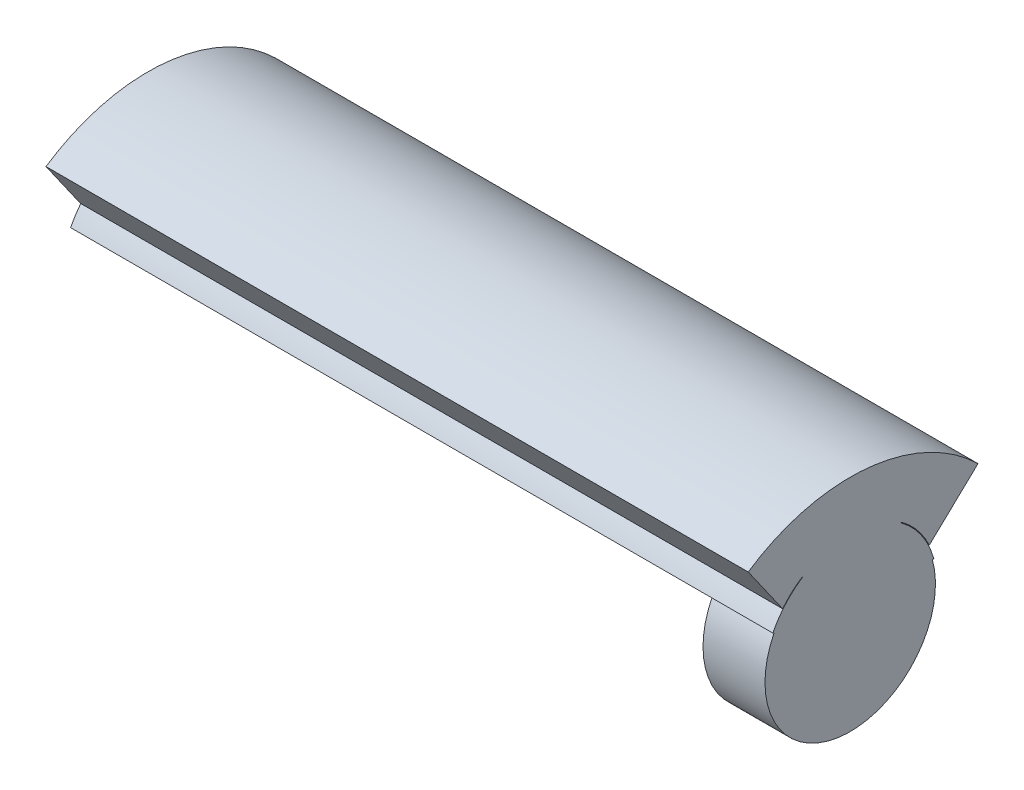
ISO-10303-21;
HEADER;
FILE_DESCRIPTION(('STEP AP214'),'2;1');
FILE_NAME('part.step','',(''),(''),'','','');
FILE_SCHEMA(('AUTOMOTIVE_DESIGN { 1 0 10303 214 1 1 1 1 }'));
ENDSEC;
DATA;
#1=APPLICATION_CONTEXT('core data for automotive mechanical design processes');
#2=APPLICATION_PROTOCOL_DEFINITION('international standard','automotive_design',2000,#1);
#3=PRODUCT_CONTEXT('',#1,'mechanical');
#4=PRODUCT('Part','Part','',(#3));
#5=PRODUCT_RELATED_PRODUCT_CATEGORY('part','',(#4));
#6=PRODUCT_DEFINITION_FORMATION('','',#4);
#7=PRODUCT_DEFINITION_CONTEXT('part definition',#1,'design');
#8=PRODUCT_DEFINITION('design','',#6,#7);
#9=PRODUCT_DEFINITION_SHAPE('','',#8);
#10=(LENGTH_UNIT() NAMED_UNIT(*) SI_UNIT(.MILLI.,.METRE.));
#11=(NAMED_UNIT(*) PLANE_ANGLE_UNIT() SI_UNIT($,.RADIAN.));
#12=(NAMED_UNIT(*) SI_UNIT($,.STERADIAN.) SOLID_ANGLE_UNIT());
#13=UNCERTAINTY_MEASURE_WITH_UNIT(LENGTH_MEASURE(1.E-05),#10,'distance_accuracy_value','');
#14=(GEOMETRIC_REPRESENTATION_CONTEXT(3) GLOBAL_UNCERTAINTY_ASSIGNED_CONTEXT((#13)) GLOBAL_UNIT_ASSIGNED_CONTEXT((#10,
#11,#12)) REPRESENTATION_CONTEXT('',''));
#15=CARTESIAN_POINT('',(0.,0.,0.));
#16=DIRECTION('',(0.,0.,1.));
#17=DIRECTION('',(1.,0.,0.));
#18=AXIS2_PLACEMENT_3D('',#15,#16,#17);
#19=CARTESIAN_POINT('',(355.,63.9564545478347,86.5130861916393));
#20=DIRECTION('',(1.,0.,0.));
#21=DIRECTION('',(0.,0.,-1.));
#22=AXIS2_PLACEMENT_3D('',#19,#20,#21);
#23=CYLINDRICAL_SURFACE('',#22,20.6352320189798);
#24=DIRECTION('',(1.,0.,0.));
#25=VECTOR('',#24,1.);
#26=CARTESIAN_POINT('',(355.,73.2097109224673,104.957327757571));
#27=LINE('',#26,#25);
#28=CARTESIAN_POINT('',(355.,73.2097109224673,104.957327757571));
#29=VERTEX_POINT('',#28);
#30=CARTESIAN_POINT('',(370.,73.2097109224673,104.957327757571));
#31=VERTEX_POINT('',#30);
#32=EDGE_CURVE('E289',#29,#31,#27,.T.);
#33=ORIENTED_EDGE('',*,*,#32,.F.);
#34=CARTESIAN_POINT('',(355.,63.9564545478347,86.5130861916393));
#35=DIRECTION('',(1.,0.,0.));
#36=DIRECTION('',(0.,0.,-1.));
#37=AXIS2_PLACEMENT_3D('',#34,#35,#36);
#38=CIRCLE('',#37,20.6352320189798);
#39=CARTESIAN_POINT('',(355.,69.3718571058935,66.6011245702596));
#40=VERTEX_POINT('',#39);
#41=EDGE_CURVE('E11',#29,#40,#38,.T.);
#42=ORIENTED_EDGE('',*,*,#41,.T.);
#43=DIRECTION('',(1.,0.,0.));
#44=VECTOR('',#43,1.);
#45=CARTESIAN_POINT('',(355.,69.3718571058935,66.6011245702596));
#46=LINE('',#45,#44);
#47=CARTESIAN_POINT('',(370.,69.3718571058935,66.6011245702596));
#48=VERTEX_POINT('',#47);
#49=EDGE_CURVE('E57',#48,#40,#46,.F.);
#50=ORIENTED_EDGE('',*,*,#49,.F.);
#51=CARTESIAN_POINT('',(370.,63.9564545478347,86.5130861916393));
#52=DIRECTION('',(1.,0.,0.));
#53=DIRECTION('',(0.,0.,-1.));
#54=AXIS2_PLACEMENT_3D('',#51,#52,#53);
#55=CIRCLE('',#54,20.6352320189798);
#56=EDGE_CURVE('E46',#31,#48,#55,.T.);
#57=ORIENTED_EDGE('',*,*,#56,.F.);
#58=EDGE_LOOP('',(#33,#42,#50,#57));
#59=FACE_BOUND('',#58,.T.);
#60=ADVANCED_FACE('F43',(#59),#23,.T.);
#61=CARTESIAN_POINT('',(355.,63.9564545478347,86.5130861916393));
#62=DIRECTION('',(1.,0.,0.));
#63=DIRECTION('',(0.,0.,-1.));
#64=AXIS2_PLACEMENT_3D('',#61,#62,#63);
#65=PLANE('',#64);
#66=ORIENTED_EDGE('',*,*,#41,.F.);
#67=DIRECTION('',(0.,-0.448420272964308,-0.893822834120172));
#68=VECTOR('',#67,1.);
#69=CARTESIAN_POINT('',(355.,63.9564545478346,86.5130861916393));
#70=LINE('',#69,#68);
#71=CARTESIAN_POINT('',(355.,72.692351211514,103.926089985811));
#72=VERTEX_POINT('',#71);
#73=EDGE_CURVE('E65',#29,#72,#70,.T.);
#74=ORIENTED_EDGE('',*,*,#73,.T.);
#75=CARTESIAN_POINT('',(355.,63.9564545478347,86.5130861916393));
#76=DIRECTION('',(1.,0.,0.));
#77=DIRECTION('',(0.,0.,-1.));
#78=AXIS2_PLACEMENT_3D('',#75,#76,#77);
#79=CIRCLE('',#78,19.4814935683668);
#80=CARTESIAN_POINT('',(355.,81.4344426394317,95.1182313922916));
#81=VERTEX_POINT('',#80);
#82=EDGE_CURVE('E285',#72,#81,#79,.F.);
#83=ORIENTED_EDGE('',*,*,#82,.T.);
#84=DIRECTION('',(0.,-0.0222625521516225,-0.999752158673187));
#85=VECTOR('',#84,1.);
#86=CARTESIAN_POINT('',(355.,81.2342551632847,86.1283428990844));
#87=LINE('',#86,#85);
#88=CARTESIAN_POINT('',(355.,81.0340676871377,77.1384544058772));
#89=VERTEX_POINT('',#88);
#90=EDGE_CURVE('E291',#81,#89,#87,.T.);
#91=ORIENTED_EDGE('',*,*,#90,.T.);
#92=CARTESIAN_POINT('',(355.,63.9564545478347,86.5130861916393));
#93=DIRECTION('',(1.,0.,0.));
#94=DIRECTION('',(0.,0.,-1.));
#95=AXIS2_PLACEMENT_3D('',#92,#93,#94);
#96=CIRCLE('',#95,19.4814935683668);
#97=CARTESIAN_POINT('',(355.,69.0690760103849,67.7144241798102));
#98=VERTEX_POINT('',#97);
#99=EDGE_CURVE('E282',#89,#98,#96,.F.);
#100=ORIENTED_EDGE('',*,*,#99,.T.);
#101=DIRECTION('',(0.,0.262434779171761,-0.964949732722419));
#102=VECTOR('',#101,1.);
#103=CARTESIAN_POINT('',(355.,63.9564545478345,86.5130861916392));
#104=LINE('',#103,#102);
#105=EDGE_CURVE('E267',#98,#40,#104,.T.);
#106=ORIENTED_EDGE('',*,*,#105,.T.);
#107=EDGE_LOOP('',(#66,#74,#83,#91,#100,#106));
#108=FACE_BOUND('',#107,.T.);
#109=ADVANCED_FACE('F300',(#108),#65,.F.);
#110=CARTESIAN_POINT('',(370.,63.9564545478347,86.5130861916393));
#111=DIRECTION('',(1.,0.,0.));
#112=DIRECTION('',(0.,0.,-1.));
#113=AXIS2_PLACEMENT_3D('',#110,#111,#112);
#114=PLANE('',#113);
#115=ORIENTED_EDGE('',*,*,#56,.T.);
#116=DIRECTION('',(0.,0.262434779171761,-0.964949732722419));
#117=VECTOR('',#116,1.);
#118=CARTESIAN_POINT('',(370.,69.0690760103849,67.7144241798102));
#119=LINE('',#118,#117);
#120=CARTESIAN_POINT('',(370.,69.4593670539627,66.2793581440778));
#121=VERTEX_POINT('',#120);
#122=EDGE_CURVE('E200',#48,#121,#119,.T.);
#123=ORIENTED_EDGE('',*,*,#122,.T.);
#124=CARTESIAN_POINT('',(370.,63.9564545478347,86.5130861916393));
#125=DIRECTION('',(1.,0.,0.));
#126=DIRECTION('',(0.,0.,-1.));
#127=AXIS2_PLACEMENT_3D('',#124,#125,#126);
#128=CIRCLE('',#127,20.9686860998198);
#129=CARTESIAN_POINT('',(370.,80.9698875905979,74.2562965282654));
#130=VERTEX_POINT('',#129);
#131=EDGE_CURVE('E174',#121,#130,#128,.T.);
#132=ORIENTED_EDGE('',*,*,#131,.T.);
#133=DIRECTION('',(0.,-0.0222625521516225,-0.999752158673186));
#134=VECTOR('',#133,1.);
#135=CARTESIAN_POINT('',(370.,81.5038252394239,98.2340198986652));
#136=LINE('',#135,#134);
#137=CARTESIAN_POINT('',(370.,80.9646850871455,74.0226658995036));
#138=VERTEX_POINT('',#137);
#139=EDGE_CURVE('E256',#130,#138,#136,.T.);
#140=ORIENTED_EDGE('',*,*,#139,.T.);
#141=CARTESIAN_POINT('',(370.,63.9564545478347,86.5130861916393));
#142=DIRECTION('',(-1.,0.,0.));
#143=DIRECTION('',(0.,0.,-1.));
#144=AXIS2_PLACEMENT_3D('',#141,#142,#143);
#145=CIRCLE('',#144,21.101907618804);
#146=CARTESIAN_POINT('',(370.,72.8377741351527,67.3711775213823));
#147=VERTEX_POINT('',#146);
#148=EDGE_CURVE('E260',#138,#147,#145,.T.);
#149=ORIENTED_EDGE('',*,*,#148,.T.);
#150=DIRECTION('',(0.,0.688782001001725,-0.724968520072465));
#151=VECTOR('',#150,1.);
#152=CARTESIAN_POINT('',(370.,84.0422777194896,55.5780232724764));
#153=LINE('',#152,#151);
#154=CARTESIAN_POINT('',(370.,84.0422777194896,55.5780232724764));
#155=VERTEX_POINT('',#154);
#156=EDGE_CURVE('E225',#147,#155,#153,.T.);
#157=ORIENTED_EDGE('',*,*,#156,.T.);
#158=CARTESIAN_POINT('',(370.,52.4819849623086,86.5215495386486));
#159=DIRECTION('',(1.,0.,0.));
#160=DIRECTION('',(0.,0.,-1.));
#161=AXIS2_PLACEMENT_3D('',#158,#159,#160);
#162=CIRCLE('',#161,44.1990259700852);
#163=CARTESIAN_POINT('',(370.,89.1441466159733,111.208384078233));
#164=VERTEX_POINT('',#163);
#165=EDGE_CURVE('E220',#155,#164,#162,.T.);
#166=ORIENTED_EDGE('',*,*,#165,.T.);
#167=DIRECTION('',(0.,-0.818745483426985,-0.574156627905585));
#168=VECTOR('',#167,1.);
#169=CARTESIAN_POINT('',(370.,89.1441466159733,111.208384078233));
#170=LINE('',#169,#168);
#171=CARTESIAN_POINT('',(370.,77.2723371062821,102.883112973602));
#172=VERTEX_POINT('',#171);
#173=EDGE_CURVE('E247',#164,#172,#170,.T.);
#174=ORIENTED_EDGE('',*,*,#173,.T.);
#175=DIRECTION('',(0.,0.740927549635329,-0.671584965727634));
#176=VECTOR('',#175,1.);
#177=CARTESIAN_POINT('',(370.,78.9435134796605,101.368340135161));
#178=LINE('',#177,#176);
#179=CARTESIAN_POINT('',(370.,78.9435134796605,101.368340135161));
#180=VERTEX_POINT('',#179);
#181=EDGE_CURVE('E250',#172,#180,#178,.T.);
#182=ORIENTED_EDGE('',*,*,#181,.T.);
#183=CARTESIAN_POINT('',(370.,63.9564545478346,86.5130861916393));
#184=DIRECTION('',(-1.,0.,0.));
#185=DIRECTION('',(0.,0.,-1.));
#186=AXIS2_PLACEMENT_3D('',#183,#184,#185);
#187=CIRCLE('',#186,21.1019076188041);
#188=CARTESIAN_POINT('',(370.,81.5038252394239,98.2340198986652));
#189=VERTEX_POINT('',#188);
#190=EDGE_CURVE('E253',#180,#189,#187,.T.);
#191=ORIENTED_EDGE('',*,*,#190,.T.);
#192=CARTESIAN_POINT('',(370.,81.4986227359715,98.0003892699034));
#193=VERTEX_POINT('',#192);
#194=EDGE_CURVE('E257',#189,#193,#136,.T.);
#195=ORIENTED_EDGE('',*,*,#194,.T.);
#196=CARTESIAN_POINT('',(370.,63.9564545478347,86.5130861916393));
#197=DIRECTION('',(1.,0.,0.));
#198=DIRECTION('',(0.,0.,-1.));
#199=AXIS2_PLACEMENT_3D('',#196,#197,#198);
#200=CIRCLE('',#199,20.9686860998198);
#201=CARTESIAN_POINT('',(370.,73.3592384924187,105.255376629157));
#202=VERTEX_POINT('',#201);
#203=EDGE_CURVE('E197',#193,#202,#200,.T.);
#204=ORIENTED_EDGE('',*,*,#203,.T.);
#205=DIRECTION('',(0.,-0.448420272964307,-0.893822834120172));
#206=VECTOR('',#205,1.);
#207=CARTESIAN_POINT('',(370.,73.3592384924187,105.255376629157));
#208=LINE('',#207,#206);
#209=EDGE_CURVE('E179',#202,#31,#208,.T.);
#210=ORIENTED_EDGE('',*,*,#209,.T.);
#211=EDGE_LOOP('',(#115,#123,#132,#140,#149,#157,#166,#174,#182,#191,#195,#204,#210));
#212=FACE_BOUND('',#211,.T.);
#213=ADVANCED_FACE('F297',(#212),#114,.T.);
#214=CARTESIAN_POINT('',(200.,81.5038252394239,98.2340198986652));
#215=DIRECTION('',(0.,-0.999752158673186,0.0222625521516225));
#216=DIRECTION('',(0.,-0.0222625521516225,-0.999752158673187));
#217=AXIS2_PLACEMENT_3D('',#214,#215,#216);
#218=PLANE('',#217);
#219=ORIENTED_EDGE('',*,*,#90,.F.);
#220=DIRECTION('',(1.,0.,0.));
#221=VECTOR('',#220,1.);
#222=CARTESIAN_POINT('',(200.,81.4344426394317,95.1182313922916));
#223=LINE('',#222,#221);
#224=CARTESIAN_POINT('',(200.,81.4344426394317,95.1182313922916));
#225=VERTEX_POINT('',#224);
#226=EDGE_CURVE('E212',#225,#81,#223,.T.);
#227=ORIENTED_EDGE('',*,*,#226,.F.);
#228=DIRECTION('',(0.,-0.0222625521516225,-0.999752158673186));
#229=VECTOR('',#228,1.);
#230=CARTESIAN_POINT('',(200.,81.5038252394239,98.2340198986652));
#231=LINE('',#230,#229);
#232=CARTESIAN_POINT('',(200.,81.0340676871377,77.1384544058772));
#233=VERTEX_POINT('',#232);
#234=EDGE_CURVE('E238',#225,#233,#231,.T.);
#235=ORIENTED_EDGE('',*,*,#234,.T.);
#236=DIRECTION('',(1.,0.,0.));
#237=VECTOR('',#236,1.);
#238=CARTESIAN_POINT('',(200.,81.0340676871377,77.1384544058772));
#239=LINE('',#238,#237);
#240=EDGE_CURVE('E215',#89,#233,#239,.F.);
#241=ORIENTED_EDGE('',*,*,#240,.F.);
#242=EDGE_LOOP('',(#219,#227,#235,#241));
#243=FACE_BOUND('',#242,.T.);
#244=ADVANCED_FACE('F345',(#243),#218,.T.);
#245=CARTESIAN_POINT('',(200.,63.9564545478347,86.5130861916393));
#246=DIRECTION('',(1.,0.,0.));
#247=DIRECTION('',(0.,0.,-1.));
#248=AXIS2_PLACEMENT_3D('',#245,#246,#247);
#249=CYLINDRICAL_SURFACE('',#248,19.4814935683668);
#250=ORIENTED_EDGE('',*,*,#82,.F.);
#251=DIRECTION('',(1.,0.,0.));
#252=VECTOR('',#251,1.);
#253=CARTESIAN_POINT('',(200.,72.692351211514,103.926089985811));
#254=LINE('',#253,#252);
#255=CARTESIAN_POINT('',(200.,72.692351211514,103.926089985811));
#256=VERTEX_POINT('',#255);
#257=EDGE_CURVE('E180',#256,#72,#254,.T.);
#258=ORIENTED_EDGE('',*,*,#257,.F.);
#259=CARTESIAN_POINT('',(200.,63.9564545478347,86.5130861916393));
#260=DIRECTION('',(-1.,0.,0.));
#261=DIRECTION('',(0.,0.,-1.));
#262=AXIS2_PLACEMENT_3D('',#259,#260,#261);
#263=CIRCLE('',#262,19.4814935683668);
#264=EDGE_CURVE('E187',#256,#225,#263,.T.);
#265=ORIENTED_EDGE('',*,*,#264,.T.);
#266=ORIENTED_EDGE('',*,*,#226,.T.);
#267=EDGE_LOOP('',(#250,#258,#265,#266));
#268=FACE_BOUND('',#267,.T.);
#269=ADVANCED_FACE('F347',(#268),#249,.F.);
#270=ORIENTED_EDGE('',*,*,#99,.F.);
#271=ORIENTED_EDGE('',*,*,#240,.T.);
#272=CARTESIAN_POINT('',(200.,69.0690760103849,67.7144241798102));
#273=VERTEX_POINT('',#272);
#274=EDGE_CURVE('E188',#233,#273,#263,.T.);
#275=ORIENTED_EDGE('',*,*,#274,.T.);
#276=DIRECTION('',(1.,0.,0.));
#277=VECTOR('',#276,1.);
#278=CARTESIAN_POINT('',(200.,69.0690760103849,67.7144241798102));
#279=LINE('',#278,#277);
#280=EDGE_CURVE('E207',#273,#98,#279,.T.);
#281=ORIENTED_EDGE('',*,*,#280,.T.);
#282=EDGE_LOOP('',(#270,#271,#275,#281));
#283=FACE_BOUND('',#282,.T.);
#284=ADVANCED_FACE('F305',(#283),#249,.F.);
#285=DIRECTION('',(1.,0.,0.));
#286=VECTOR('',#285,1.);
#287=CARTESIAN_POINT('',(200.,80.9698875905979,74.2562965282654));
#288=LINE('',#287,#286);
#289=CARTESIAN_POINT('',(200.,80.9698875905979,74.2562965282654));
#290=VERTEX_POINT('',#289);
#291=EDGE_CURVE('E217',#290,#130,#288,.T.);
#292=ORIENTED_EDGE('',*,*,#291,.F.);
#293=CARTESIAN_POINT('',(200.,80.9646850871455,74.0226658995036));
#294=VERTEX_POINT('',#293);
#295=EDGE_CURVE('E234',#290,#294,#231,.T.);
#296=ORIENTED_EDGE('',*,*,#295,.T.);
#297=DIRECTION('',(1.,0.,0.));
#298=VECTOR('',#297,1.);
#299=CARTESIAN_POINT('',(200.,80.9646850871455,74.0226658995036));
#300=LINE('',#299,#298);
#301=EDGE_CURVE('E270',#294,#138,#300,.T.);
#302=ORIENTED_EDGE('',*,*,#301,.T.);
#303=ORIENTED_EDGE('',*,*,#139,.F.);
#304=EDGE_LOOP('',(#292,#296,#302,#303));
#305=FACE_BOUND('',#304,.T.);
#306=ADVANCED_FACE('F318',(#305),#218,.T.);
#307=CARTESIAN_POINT('',(200.,52.4819849623086,86.5215495386486));
#308=DIRECTION('',(1.,0.,0.));
#309=DIRECTION('',(0.,0.,-1.));
#310=AXIS2_PLACEMENT_3D('',#307,#308,#309);
#311=CYLINDRICAL_SURFACE('',#310,44.1990259700852);
#312=ORIENTED_EDGE('',*,*,#165,.F.);
#313=DIRECTION('',(1.,0.,0.));
#314=VECTOR('',#313,1.);
#315=CARTESIAN_POINT('',(200.,84.0422777194896,55.5780232724764));
#316=LINE('',#315,#314);
#317=CARTESIAN_POINT('',(200.,84.0422777194896,55.5780232724764));
#318=VERTEX_POINT('',#317);
#319=EDGE_CURVE('E265',#318,#155,#316,.T.);
#320=ORIENTED_EDGE('',*,*,#319,.F.);
#321=CARTESIAN_POINT('',(200.,52.4819849623086,86.5215495386486));
#322=DIRECTION('',(1.,0.,0.));
#323=DIRECTION('',(0.,0.,-1.));
#324=AXIS2_PLACEMENT_3D('',#321,#322,#323);
#325=CIRCLE('',#324,44.1990259700852);
#326=CARTESIAN_POINT('',(200.,89.1441466159733,111.208384078233));
#327=VERTEX_POINT('',#326);
#328=EDGE_CURVE('E221',#318,#327,#325,.T.);
#329=ORIENTED_EDGE('',*,*,#328,.T.);
#330=DIRECTION('',(1.,0.,0.));
#331=VECTOR('',#330,1.);
#332=CARTESIAN_POINT('',(200.,89.1441466159733,111.208384078233));
#333=LINE('',#332,#331);
#334=EDGE_CURVE('E244',#327,#164,#333,.T.);
#335=ORIENTED_EDGE('',*,*,#334,.T.);
#336=EDGE_LOOP('',(#312,#320,#329,#335));
#337=FACE_BOUND('',#336,.T.);
#338=ADVANCED_FACE('F328',(#337),#311,.T.);
#339=CARTESIAN_POINT('',(200.,84.0422777194896,55.5780232724764));
#340=DIRECTION('',(0.,-0.724968520072465,-0.688782001001725));
#341=DIRECTION('',(0.,0.688782001001725,-0.724968520072465));
#342=AXIS2_PLACEMENT_3D('',#339,#340,#341);
#343=PLANE('',#342);
#344=ORIENTED_EDGE('',*,*,#156,.F.);
#345=DIRECTION('',(1.,0.,0.));
#346=VECTOR('',#345,1.);
#347=CARTESIAN_POINT('',(200.,72.8377741351527,67.3711775213823));
#348=LINE('',#347,#346);
#349=CARTESIAN_POINT('',(200.,72.8377741351527,67.3711775213823));
#350=VERTEX_POINT('',#349);
#351=EDGE_CURVE('E268',#350,#147,#348,.T.);
#352=ORIENTED_EDGE('',*,*,#351,.F.);
#353=DIRECTION('',(0.,0.688782001001725,-0.724968520072465));
#354=VECTOR('',#353,1.);
#355=CARTESIAN_POINT('',(200.,84.0422777194896,55.5780232724764));
#356=LINE('',#355,#354);
#357=EDGE_CURVE('E241',#350,#318,#356,.T.);
#358=ORIENTED_EDGE('',*,*,#357,.T.);
#359=ORIENTED_EDGE('',*,*,#319,.T.);
#360=EDGE_LOOP('',(#344,#352,#358,#359));
#361=FACE_BOUND('',#360,.T.);
#362=ADVANCED_FACE('F324',(#361),#343,.T.);
#363=CARTESIAN_POINT('',(200.,63.9564545478347,86.5130861916393));
#364=DIRECTION('',(1.,0.,0.));
#365=DIRECTION('',(0.,0.,-1.));
#366=AXIS2_PLACEMENT_3D('',#363,#364,#365);
#367=CYLINDRICAL_SURFACE('',#366,21.101907618804);
#368=ORIENTED_EDGE('',*,*,#148,.F.);
#369=ORIENTED_EDGE('',*,*,#301,.F.);
#370=CARTESIAN_POINT('',(200.,63.9564545478347,86.5130861916393));
#371=DIRECTION('',(-1.,0.,0.));
#372=DIRECTION('',(0.,0.,-1.));
#373=AXIS2_PLACEMENT_3D('',#370,#371,#372);
#374=CIRCLE('',#373,21.101907618804);
#375=EDGE_CURVE('E237',#294,#350,#374,.T.);
#376=ORIENTED_EDGE('',*,*,#375,.T.);
#377=ORIENTED_EDGE('',*,*,#351,.T.);
#378=EDGE_LOOP('',(#368,#369,#376,#377));
#379=FACE_BOUND('',#378,.T.);
#380=ADVANCED_FACE('F321',(#379),#367,.F.);
#381=DIRECTION('',(1.,0.,0.));
#382=VECTOR('',#381,1.);
#383=CARTESIAN_POINT('',(200.,81.4986227359715,98.0003892699034));
#384=LINE('',#383,#382);
#385=CARTESIAN_POINT('',(200.,81.4986227359715,98.0003892699034));
#386=VERTEX_POINT('',#385);
#387=EDGE_CURVE('E169',#193,#386,#384,.F.);
#388=ORIENTED_EDGE('',*,*,#387,.F.);
#389=ORIENTED_EDGE('',*,*,#194,.F.);
#390=DIRECTION('',(1.,0.,0.));
#391=VECTOR('',#390,1.);
#392=CARTESIAN_POINT('',(200.,81.5038252394239,98.2340198986652));
#393=LINE('',#392,#391);
#394=CARTESIAN_POINT('',(200.,81.5038252394239,98.2340198986652));
#395=VERTEX_POINT('',#394);
#396=EDGE_CURVE('E273',#395,#189,#393,.T.);
#397=ORIENTED_EDGE('',*,*,#396,.F.);
#398=EDGE_CURVE('E235',#395,#386,#231,.T.);
#399=ORIENTED_EDGE('',*,*,#398,.T.);
#400=EDGE_LOOP('',(#388,#389,#397,#399));
#401=FACE_BOUND('',#400,.T.);
#402=ADVANCED_FACE('F343',(#401),#218,.T.);
#403=CARTESIAN_POINT('',(200.,63.9564545478346,86.5130861916393));
#404=DIRECTION('',(1.,0.,0.));
#405=DIRECTION('',(0.,0.,-1.));
#406=AXIS2_PLACEMENT_3D('',#403,#404,#405);
#407=CYLINDRICAL_SURFACE('',#406,21.1019076188041);
#408=ORIENTED_EDGE('',*,*,#190,.F.);
#409=DIRECTION('',(1.,0.,0.));
#410=VECTOR('',#409,1.);
#411=CARTESIAN_POINT('',(200.,78.9435134796605,101.368340135161));
#412=LINE('',#411,#410);
#413=CARTESIAN_POINT('',(200.,78.9435134796605,101.368340135161));
#414=VERTEX_POINT('',#413);
#415=EDGE_CURVE('E275',#414,#180,#412,.T.);
#416=ORIENTED_EDGE('',*,*,#415,.F.);
#417=CARTESIAN_POINT('',(200.,63.9564545478346,86.5130861916393));
#418=DIRECTION('',(-1.,0.,0.));
#419=DIRECTION('',(0.,0.,-1.));
#420=AXIS2_PLACEMENT_3D('',#417,#418,#419);
#421=CIRCLE('',#420,21.1019076188041);
#422=EDGE_CURVE('E231',#414,#395,#421,.T.);
#423=ORIENTED_EDGE('',*,*,#422,.T.);
#424=ORIENTED_EDGE('',*,*,#396,.T.);
#425=EDGE_LOOP('',(#408,#416,#423,#424));
#426=FACE_BOUND('',#425,.T.);
#427=ADVANCED_FACE('F340',(#426),#407,.F.);
#428=CARTESIAN_POINT('',(200.,78.9435134796605,101.368340135161));
#429=DIRECTION('',(0.,-0.671584965727634,-0.740927549635329));
#430=DIRECTION('',(0.,0.740927549635329,-0.671584965727634));
#431=AXIS2_PLACEMENT_3D('',#428,#429,#430);
#432=PLANE('',#431);
#433=ORIENTED_EDGE('',*,*,#181,.F.);
#434=DIRECTION('',(1.,0.,0.));
#435=VECTOR('',#434,1.);
#436=CARTESIAN_POINT('',(200.,77.2723371062821,102.883112973602));
#437=LINE('',#436,#435);
#438=CARTESIAN_POINT('',(200.,77.2723371062821,102.883112973602));
#439=VERTEX_POINT('',#438);
#440=EDGE_CURVE('E277',#439,#172,#437,.T.);
#441=ORIENTED_EDGE('',*,*,#440,.F.);
#442=DIRECTION('',(0.,0.740927549635329,-0.671584965727634));
#443=VECTOR('',#442,1.);
#444=CARTESIAN_POINT('',(200.,78.9435134796605,101.368340135161));
#445=LINE('',#444,#443);
#446=EDGE_CURVE('E228',#439,#414,#445,.T.);
#447=ORIENTED_EDGE('',*,*,#446,.T.);
#448=ORIENTED_EDGE('',*,*,#415,.T.);
#449=EDGE_LOOP('',(#433,#441,#447,#448));
#450=FACE_BOUND('',#449,.T.);
#451=ADVANCED_FACE('F336',(#450),#432,.T.);
#452=CARTESIAN_POINT('',(200.,89.1441466159733,111.208384078233));
#453=DIRECTION('',(0.,-0.574156627905585,0.818745483426985));
#454=DIRECTION('',(0.,-0.818745483426985,-0.574156627905585));
#455=AXIS2_PLACEMENT_3D('',#452,#453,#454);
#456=PLANE('',#455);
#457=ORIENTED_EDGE('',*,*,#173,.F.);
#458=ORIENTED_EDGE('',*,*,#334,.F.);
#459=DIRECTION('',(0.,-0.818745483426985,-0.574156627905585));
#460=VECTOR('',#459,1.);
#461=CARTESIAN_POINT('',(200.,89.1441466159733,111.208384078233));
#462=LINE('',#461,#460);
#463=EDGE_CURVE('E224',#327,#439,#462,.T.);
#464=ORIENTED_EDGE('',*,*,#463,.T.);
#465=ORIENTED_EDGE('',*,*,#440,.T.);
#466=EDGE_LOOP('',(#457,#458,#464,#465));
#467=FACE_BOUND('',#466,.T.);
#468=ADVANCED_FACE('F332',(#467),#456,.T.);
#469=CARTESIAN_POINT('',(200.,52.4819849623086,86.5215495386486));
#470=DIRECTION('',(1.,0.,0.));
#471=DIRECTION('',(0.,0.,-1.));
#472=AXIS2_PLACEMENT_3D('',#469,#470,#471);
#473=PLANE('',#472);
#474=ORIENTED_EDGE('',*,*,#234,.F.);
#475=ORIENTED_EDGE('',*,*,#264,.F.);
#476=DIRECTION('',(0.,-0.448420272964307,-0.893822834120172));
#477=VECTOR('',#476,1.);
#478=CARTESIAN_POINT('',(200.,73.3592384924187,105.255376629157));
#479=LINE('',#478,#477);
#480=CARTESIAN_POINT('',(200.,73.3592384924187,105.255376629157));
#481=VERTEX_POINT('',#480);
#482=EDGE_CURVE('E173',#481,#256,#479,.T.);
#483=ORIENTED_EDGE('',*,*,#482,.F.);
#484=CARTESIAN_POINT('',(200.,63.9564545478347,86.5130861916393));
#485=DIRECTION('',(1.,0.,0.));
#486=DIRECTION('',(0.,0.,-1.));
#487=AXIS2_PLACEMENT_3D('',#484,#485,#486);
#488=CIRCLE('',#487,20.9686860998198);
#489=EDGE_CURVE('E163',#386,#481,#488,.T.);
#490=ORIENTED_EDGE('',*,*,#489,.F.);
#491=ORIENTED_EDGE('',*,*,#398,.F.);
#492=ORIENTED_EDGE('',*,*,#422,.F.);
#493=ORIENTED_EDGE('',*,*,#446,.F.);
#494=ORIENTED_EDGE('',*,*,#463,.F.);
#495=ORIENTED_EDGE('',*,*,#328,.F.);
#496=ORIENTED_EDGE('',*,*,#357,.F.);
#497=ORIENTED_EDGE('',*,*,#375,.F.);
#498=ORIENTED_EDGE('',*,*,#295,.F.);
#499=CARTESIAN_POINT('',(200.,63.9564545478347,86.5130861916393));
#500=DIRECTION('',(1.,0.,0.));
#501=DIRECTION('',(0.,0.,-1.));
#502=AXIS2_PLACEMENT_3D('',#499,#500,#501);
#503=CIRCLE('',#502,20.9686860998198);
#504=CARTESIAN_POINT('',(200.,69.4593670539627,66.2793581440778));
#505=VERTEX_POINT('',#504);
#506=EDGE_CURVE('E181',#505,#290,#503,.T.);
#507=ORIENTED_EDGE('',*,*,#506,.F.);
#508=DIRECTION('',(0.,0.262434779171761,-0.964949732722419));
#509=VECTOR('',#508,1.);
#510=CARTESIAN_POINT('',(200.,69.0690760103849,67.7144241798102));
#511=LINE('',#510,#509);
#512=EDGE_CURVE('E192',#273,#505,#511,.T.);
#513=ORIENTED_EDGE('',*,*,#512,.F.);
#514=ORIENTED_EDGE('',*,*,#274,.F.);
#515=EDGE_LOOP('',(#474,#475,#483,#490,#491,#492,#493,#494,#495,#496,#497,#498,#507,#513,#514));
#516=FACE_BOUND('',#515,.T.);
#517=ADVANCED_FACE('F185',(#516),#473,.F.);
#518=CARTESIAN_POINT('',(200.,73.3592384924187,105.255376629157));
#519=DIRECTION('',(0.,-0.893822834120172,0.448420272964308));
#520=DIRECTION('',(0.,-0.448420272964308,-0.893822834120172));
#521=AXIS2_PLACEMENT_3D('',#518,#519,#520);
#522=PLANE('',#521);
#523=ORIENTED_EDGE('',*,*,#73,.F.);
#524=ORIENTED_EDGE('',*,*,#32,.T.);
#525=ORIENTED_EDGE('',*,*,#209,.F.);
#526=DIRECTION('',(1.,0.,0.));
#527=VECTOR('',#526,1.);
#528=CARTESIAN_POINT('',(200.,73.3592384924187,105.255376629157));
#529=LINE('',#528,#527);
#530=EDGE_CURVE('E167',#481,#202,#529,.T.);
#531=ORIENTED_EDGE('',*,*,#530,.F.);
#532=ORIENTED_EDGE('',*,*,#482,.T.);
#533=ORIENTED_EDGE('',*,*,#257,.T.);
#534=EDGE_LOOP('',(#523,#524,#525,#531,#532,#533));
#535=FACE_BOUND('',#534,.T.);
#536=ADVANCED_FACE('F177',(#535),#522,.T.);
#537=CARTESIAN_POINT('',(200.,63.9564545478347,86.5130861916393));
#538=DIRECTION('',(1.,0.,0.));
#539=DIRECTION('',(0.,0.,-1.));
#540=AXIS2_PLACEMENT_3D('',#537,#538,#539);
#541=CYLINDRICAL_SURFACE('',#540,20.9686860998198);
#542=ORIENTED_EDGE('',*,*,#203,.F.);
#543=ORIENTED_EDGE('',*,*,#387,.T.);
#544=ORIENTED_EDGE('',*,*,#489,.T.);
#545=ORIENTED_EDGE('',*,*,#530,.T.);
#546=EDGE_LOOP('',(#542,#543,#544,#545));
#547=FACE_BOUND('',#546,.T.);
#548=ADVANCED_FACE('F166',(#547),#541,.T.);
#549=CARTESIAN_POINT('',(200.,63.9564545478347,86.5130861916393));
#550=DIRECTION('',(1.,0.,0.));
#551=DIRECTION('',(0.,0.,-1.));
#552=AXIS2_PLACEMENT_3D('',#549,#550,#551);
#553=CYLINDRICAL_SURFACE('',#552,20.9686860998198);
#554=ORIENTED_EDGE('',*,*,#506,.T.);
#555=ORIENTED_EDGE('',*,*,#291,.T.);
#556=ORIENTED_EDGE('',*,*,#131,.F.);
#557=DIRECTION('',(1.,0.,0.));
#558=VECTOR('',#557,1.);
#559=CARTESIAN_POINT('',(200.,69.4593670539627,66.2793581440778));
#560=LINE('',#559,#558);
#561=EDGE_CURVE('E204',#505,#121,#560,.T.);
#562=ORIENTED_EDGE('',*,*,#561,.F.);
#563=EDGE_LOOP('',(#554,#555,#556,#562));
#564=FACE_BOUND('',#563,.T.);
#565=ADVANCED_FACE('F313',(#564),#553,.T.);
#566=CARTESIAN_POINT('',(200.,69.0690760103849,67.7144241798102));
#567=DIRECTION('',(0.,-0.964949732722419,-0.262434779171761));
#568=DIRECTION('',(0.,0.262434779171761,-0.964949732722419));
#569=AXIS2_PLACEMENT_3D('',#566,#567,#568);
#570=PLANE('',#569);
#571=ORIENTED_EDGE('',*,*,#122,.F.);
#572=ORIENTED_EDGE('',*,*,#49,.T.);
#573=ORIENTED_EDGE('',*,*,#105,.F.);
#574=ORIENTED_EDGE('',*,*,#280,.F.);
#575=ORIENTED_EDGE('',*,*,#512,.T.);
#576=ORIENTED_EDGE('',*,*,#561,.T.);
#577=EDGE_LOOP('',(#571,#572,#573,#574,#575,#576));
#578=FACE_BOUND('',#577,.T.);
#579=ADVANCED_FACE('F302',(#578),#570,.T.);
#580=CLOSED_SHELL('',(#60,#109,#213,#244,#269,#284,#306,#338,#362,#380,#402,#427,#451,#468,#517,
#536,#548,#565,#579));
#581=MANIFOLD_SOLID_BREP('B2',#580);
#582=ADVANCED_BREP_SHAPE_REPRESENTATION('',(#18,#581),#14);
#583=SHAPE_DEFINITION_REPRESENTATION(#9,#582);
ENDSEC;
END-ISO-10303-21;
